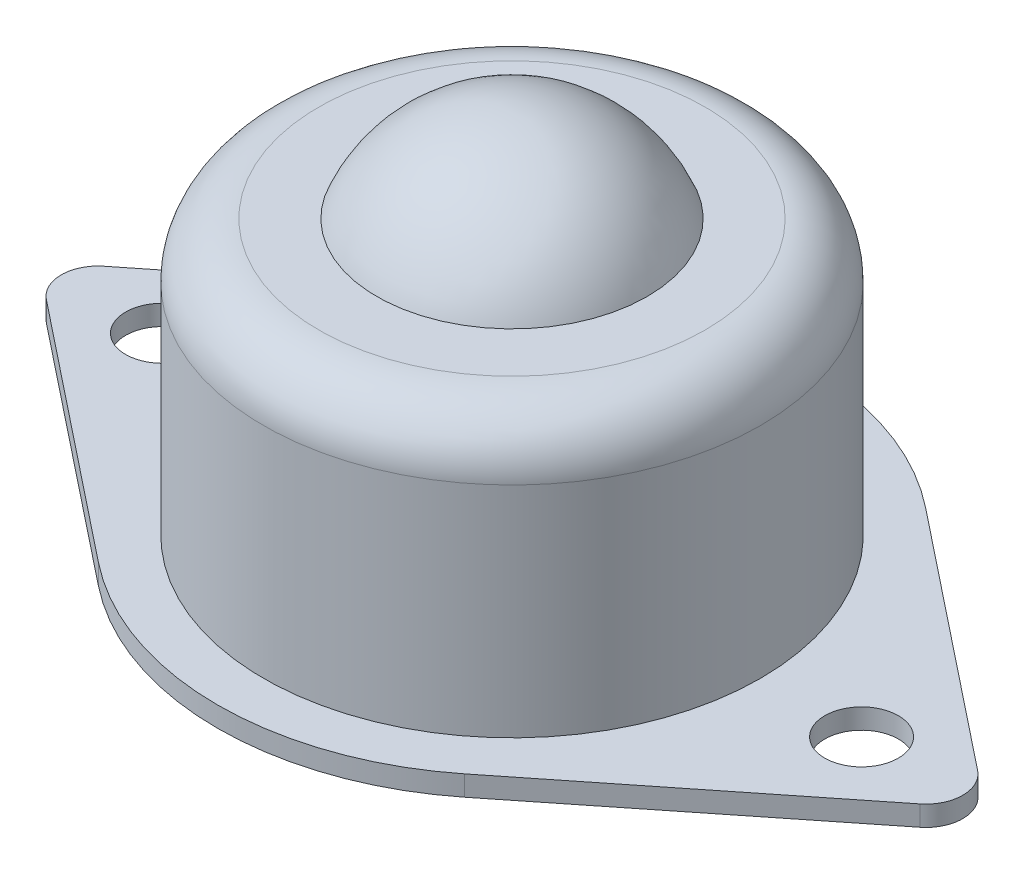
ISO-10303-21;
HEADER;
FILE_DESCRIPTION(('STEP AP214'),'2;1');
FILE_NAME('part.step','',(''),(''),'','','');
FILE_SCHEMA(('AUTOMOTIVE_DESIGN { 1 0 10303 214 1 1 1 1 }'));
ENDSEC;
DATA;
#1=APPLICATION_CONTEXT('core data for automotive mechanical design processes');
#2=APPLICATION_PROTOCOL_DEFINITION('international standard','automotive_design',2000,#1);
#3=PRODUCT_CONTEXT('',#1,'mechanical');
#4=PRODUCT('Part','Part','',(#3));
#5=PRODUCT_RELATED_PRODUCT_CATEGORY('part','',(#4));
#6=PRODUCT_DEFINITION_FORMATION('','',#4);
#7=PRODUCT_DEFINITION_CONTEXT('part definition',#1,'design');
#8=PRODUCT_DEFINITION('design','',#6,#7);
#9=PRODUCT_DEFINITION_SHAPE('','',#8);
#10=(LENGTH_UNIT() NAMED_UNIT(*) SI_UNIT(.MILLI.,.METRE.));
#11=(NAMED_UNIT(*) PLANE_ANGLE_UNIT() SI_UNIT($,.RADIAN.));
#12=(NAMED_UNIT(*) SI_UNIT($,.STERADIAN.) SOLID_ANGLE_UNIT());
#13=UNCERTAINTY_MEASURE_WITH_UNIT(LENGTH_MEASURE(1.E-05),#10,'distance_accuracy_value','');
#14=(GEOMETRIC_REPRESENTATION_CONTEXT(3) GLOBAL_UNCERTAINTY_ASSIGNED_CONTEXT((#13)) GLOBAL_UNIT_ASSIGNED_CONTEXT((#10,
#11,#12)) REPRESENTATION_CONTEXT('',''));
#15=CARTESIAN_POINT('',(0.,0.,0.));
#16=DIRECTION('',(0.,0.,1.));
#17=DIRECTION('',(1.,0.,0.));
#18=AXIS2_PLACEMENT_3D('',#15,#16,#17);
#19=CARTESIAN_POINT('',(0.,1.1,0.));
#20=DIRECTION('',(0.,1.,0.));
#21=DIRECTION('',(0.,0.,1.));
#22=AXIS2_PLACEMENT_3D('',#19,#20,#21);
#23=PLANE('',#22);
#24=CARTESIAN_POINT('',(19.,1.1,0.));
#25=DIRECTION('',(0.,1.,0.));
#26=DIRECTION('',(0.,0.,-1.));
#27=AXIS2_PLACEMENT_3D('',#24,#25,#26);
#28=CIRCLE('',#27,2.);
#29=CARTESIAN_POINT('',(19.,1.1,-2.00000000000001));
#30=VERTEX_POINT('',#29);
#31=EDGE_CURVE('E183',#30,#30,#28,.T.);
#32=ORIENTED_EDGE('',*,*,#31,.F.);
#33=EDGE_LOOP('',(#32));
#34=FACE_BOUND('',#33,.T.);
#35=CARTESIAN_POINT('',(0.,1.1,0.));
#36=DIRECTION('',(0.,1.,0.));
#37=DIRECTION('',(0.,0.,1.));
#38=AXIS2_PLACEMENT_3D('',#35,#36,#37);
#39=CIRCLE('',#38,16.);
#40=CARTESIAN_POINT('',(9.95555555555555,1.1,-12.5254506338194));
#41=VERTEX_POINT('',#40);
#42=CARTESIAN_POINT('',(-9.95555555555556,1.1,-12.5254506338194));
#43=VERTEX_POINT('',#42);
#44=EDGE_CURVE('E146',#41,#43,#39,.T.);
#45=ORIENTED_EDGE('',*,*,#44,.T.);
#46=DIRECTION('',(-0.782840664613713,0.,0.622222222222222));
#47=VECTOR('',#46,1.);
#48=CARTESIAN_POINT('',(-9.95555555555556,1.1,-12.5254506338194));
#49=LINE('',#48,#47);
#50=CARTESIAN_POINT('',(-23.7444444444444,1.1,-1.56568132922743));
#51=VERTEX_POINT('',#50);
#52=EDGE_CURVE('E94',#43,#51,#49,.T.);
#53=ORIENTED_EDGE('',*,*,#52,.T.);
#54=CARTESIAN_POINT('',(-22.5,1.1,0.));
#55=DIRECTION('',(0.,1.,0.));
#56=DIRECTION('',(0.,0.,1.));
#57=AXIS2_PLACEMENT_3D('',#54,#55,#56);
#58=CIRCLE('',#57,2.);
#59=CARTESIAN_POINT('',(-23.7444444444444,1.1,1.56568132922743));
#60=VERTEX_POINT('',#59);
#61=EDGE_CURVE('E161',#51,#60,#58,.T.);
#62=ORIENTED_EDGE('',*,*,#61,.T.);
#63=DIRECTION('',(0.782840664613713,0.,0.622222222222222));
#64=VECTOR('',#63,1.);
#65=CARTESIAN_POINT('',(-9.95555555555556,1.1,12.5254506338194));
#66=LINE('',#65,#64);
#67=CARTESIAN_POINT('',(-9.95555555555556,1.1,12.5254506338194));
#68=VERTEX_POINT('',#67);
#69=EDGE_CURVE('E174',#60,#68,#66,.T.);
#70=ORIENTED_EDGE('',*,*,#69,.T.);
#71=CARTESIAN_POINT('',(0.,1.1,0.));
#72=DIRECTION('',(0.,1.,0.));
#73=DIRECTION('',(0.,0.,1.));
#74=AXIS2_PLACEMENT_3D('',#71,#72,#73);
#75=CIRCLE('',#74,16.);
#76=CARTESIAN_POINT('',(9.95555555555555,1.1,12.5254506338194));
#77=VERTEX_POINT('',#76);
#78=EDGE_CURVE('E113',#68,#77,#75,.T.);
#79=ORIENTED_EDGE('',*,*,#78,.T.);
#80=DIRECTION('',(0.782840664613713,0.,-0.622222222222222));
#81=VECTOR('',#80,1.);
#82=CARTESIAN_POINT('',(9.95555555555556,1.1,12.5254506338194));
#83=LINE('',#82,#81);
#84=CARTESIAN_POINT('',(23.7444444444444,1.1,1.56568132922743));
#85=VERTEX_POINT('',#84);
#86=EDGE_CURVE('E107',#77,#85,#83,.T.);
#87=ORIENTED_EDGE('',*,*,#86,.T.);
#88=CARTESIAN_POINT('',(22.5,1.1,0.));
#89=DIRECTION('',(0.,1.,0.));
#90=DIRECTION('',(0.,0.,-1.));
#91=AXIS2_PLACEMENT_3D('',#88,#89,#90);
#92=CIRCLE('',#91,2.00000000000001);
#93=CARTESIAN_POINT('',(23.7444444444445,1.1,-1.56568132922744));
#94=VERTEX_POINT('',#93);
#95=EDGE_CURVE('E111',#85,#94,#92,.T.);
#96=ORIENTED_EDGE('',*,*,#95,.T.);
#97=DIRECTION('',(-0.782840664613713,0.,-0.622222222222222));
#98=VECTOR('',#97,1.);
#99=CARTESIAN_POINT('',(9.95555555555555,1.1,-12.5254506338194));
#100=LINE('',#99,#98);
#101=EDGE_CURVE('E51',#94,#41,#100,.T.);
#102=ORIENTED_EDGE('',*,*,#101,.T.);
#103=EDGE_LOOP('',(#45,#53,#62,#70,#79,#87,#96,#102));
#104=FACE_BOUND('',#103,.T.);
#105=CARTESIAN_POINT('',(-19.,1.1,0.));
#106=DIRECTION('',(0.,1.,0.));
#107=DIRECTION('',(0.,0.,1.));
#108=AXIS2_PLACEMENT_3D('',#105,#106,#107);
#109=CIRCLE('',#108,2.);
#110=CARTESIAN_POINT('',(-19.,1.1,2.));
#111=VERTEX_POINT('',#110);
#112=EDGE_CURVE('E135',#111,#111,#109,.T.);
#113=ORIENTED_EDGE('',*,*,#112,.F.);
#114=EDGE_LOOP('',(#113));
#115=FACE_BOUND('',#114,.T.);
#116=CARTESIAN_POINT('',(0.,1.1,0.));
#117=DIRECTION('',(0.,-1.,0.));
#118=DIRECTION('',(1.,0.,0.));
#119=AXIS2_PLACEMENT_3D('',#116,#117,#118);
#120=CIRCLE('',#119,13.5);
#121=CARTESIAN_POINT('',(13.5,1.1,0.));
#122=VERTEX_POINT('',#121);
#123=EDGE_CURVE('E200',#122,#122,#120,.T.);
#124=ORIENTED_EDGE('',*,*,#123,.T.);
#125=EDGE_LOOP('',(#124));
#126=FACE_BOUND('',#125,.T.);
#127=ADVANCED_FACE('F34',(#34,#104,#115,#126),#23,.T.);
#128=CARTESIAN_POINT('',(0.,0.,0.));
#129=DIRECTION('',(0.,1.,0.));
#130=DIRECTION('',(0.,0.,1.));
#131=AXIS2_PLACEMENT_3D('',#128,#129,#130);
#132=PLANE('',#131);
#133=CARTESIAN_POINT('',(-19.,0.,0.));
#134=DIRECTION('',(0.,1.,0.));
#135=DIRECTION('',(0.,0.,1.));
#136=AXIS2_PLACEMENT_3D('',#133,#134,#135);
#137=CIRCLE('',#136,2.);
#138=CARTESIAN_POINT('',(-19.,0.,2.));
#139=VERTEX_POINT('',#138);
#140=EDGE_CURVE('E180',#139,#139,#137,.T.);
#141=ORIENTED_EDGE('',*,*,#140,.T.);
#142=EDGE_LOOP('',(#141));
#143=FACE_BOUND('',#142,.T.);
#144=CARTESIAN_POINT('',(0.,0.,0.));
#145=DIRECTION('',(0.,1.,0.));
#146=DIRECTION('',(0.,0.,1.));
#147=AXIS2_PLACEMENT_3D('',#144,#145,#146);
#148=CIRCLE('',#147,16.);
#149=CARTESIAN_POINT('',(9.95555555555555,0.,-12.5254506338194));
#150=VERTEX_POINT('',#149);
#151=CARTESIAN_POINT('',(-9.95555555555556,0.,-12.5254506338194));
#152=VERTEX_POINT('',#151);
#153=EDGE_CURVE('E131',#150,#152,#148,.T.);
#154=ORIENTED_EDGE('',*,*,#153,.F.);
#155=DIRECTION('',(-0.782840664613713,0.,-0.622222222222222));
#156=VECTOR('',#155,1.);
#157=CARTESIAN_POINT('',(9.95555555555555,0.,-12.5254506338194));
#158=LINE('',#157,#156);
#159=CARTESIAN_POINT('',(23.7444444444445,0.,-1.56568132922744));
#160=VERTEX_POINT('',#159);
#161=EDGE_CURVE('E86',#160,#150,#158,.T.);
#162=ORIENTED_EDGE('',*,*,#161,.F.);
#163=CARTESIAN_POINT('',(22.5,0.,0.));
#164=DIRECTION('',(0.,1.,0.));
#165=DIRECTION('',(0.,0.,-1.));
#166=AXIS2_PLACEMENT_3D('',#163,#164,#165);
#167=CIRCLE('',#166,2.00000000000001);
#168=CARTESIAN_POINT('',(23.7444444444444,0.,1.56568132922743));
#169=VERTEX_POINT('',#168);
#170=EDGE_CURVE('E80',#169,#160,#167,.T.);
#171=ORIENTED_EDGE('',*,*,#170,.F.);
#172=DIRECTION('',(0.782840664613713,0.,-0.622222222222222));
#173=VECTOR('',#172,1.);
#174=CARTESIAN_POINT('',(9.95555555555556,0.,12.5254506338194));
#175=LINE('',#174,#173);
#176=CARTESIAN_POINT('',(9.95555555555555,0.,12.5254506338194));
#177=VERTEX_POINT('',#176);
#178=EDGE_CURVE('E121',#177,#169,#175,.T.);
#179=ORIENTED_EDGE('',*,*,#178,.F.);
#180=CARTESIAN_POINT('',(0.,0.,0.));
#181=DIRECTION('',(0.,1.,0.));
#182=DIRECTION('',(0.,0.,1.));
#183=AXIS2_PLACEMENT_3D('',#180,#181,#182);
#184=CIRCLE('',#183,16.);
#185=CARTESIAN_POINT('',(-9.95555555555556,0.,12.5254506338194));
#186=VERTEX_POINT('',#185);
#187=EDGE_CURVE('E141',#186,#177,#184,.T.);
#188=ORIENTED_EDGE('',*,*,#187,.F.);
#189=DIRECTION('',(0.782840664613713,0.,0.622222222222222));
#190=VECTOR('',#189,1.);
#191=CARTESIAN_POINT('',(-9.95555555555556,0.,12.5254506338194));
#192=LINE('',#191,#190);
#193=CARTESIAN_POINT('',(-23.7444444444444,0.,1.56568132922743));
#194=VERTEX_POINT('',#193);
#195=EDGE_CURVE('E139',#194,#186,#192,.T.);
#196=ORIENTED_EDGE('',*,*,#195,.F.);
#197=CARTESIAN_POINT('',(-22.5,0.,0.));
#198=DIRECTION('',(0.,1.,0.));
#199=DIRECTION('',(0.,0.,1.));
#200=AXIS2_PLACEMENT_3D('',#197,#198,#199);
#201=CIRCLE('',#200,2.);
#202=CARTESIAN_POINT('',(-23.7444444444444,0.,-1.56568132922743));
#203=VERTEX_POINT('',#202);
#204=EDGE_CURVE('E137',#203,#194,#201,.T.);
#205=ORIENTED_EDGE('',*,*,#204,.F.);
#206=DIRECTION('',(-0.782840664613713,0.,0.622222222222222));
#207=VECTOR('',#206,1.);
#208=CARTESIAN_POINT('',(-9.95555555555556,0.,-12.5254506338194));
#209=LINE('',#208,#207);
#210=EDGE_CURVE('E134',#152,#203,#209,.T.);
#211=ORIENTED_EDGE('',*,*,#210,.F.);
#212=EDGE_LOOP('',(#154,#162,#171,#179,#188,#196,#205,#211));
#213=FACE_BOUND('',#212,.T.);
#214=CARTESIAN_POINT('',(19.,0.,0.));
#215=DIRECTION('',(0.,1.,0.));
#216=DIRECTION('',(0.,0.,-1.));
#217=AXIS2_PLACEMENT_3D('',#214,#215,#216);
#218=CIRCLE('',#217,2.);
#219=CARTESIAN_POINT('',(19.,0.,-2.00000000000001));
#220=VERTEX_POINT('',#219);
#221=EDGE_CURVE('E186',#220,#220,#218,.T.);
#222=ORIENTED_EDGE('',*,*,#221,.T.);
#223=EDGE_LOOP('',(#222));
#224=FACE_BOUND('',#223,.T.);
#225=ADVANCED_FACE('F165',(#143,#213,#224),#132,.F.);
#226=CARTESIAN_POINT('',(0.,1.1,0.));
#227=DIRECTION('',(0.,-1.,0.));
#228=DIRECTION('',(0.,0.,-1.));
#229=AXIS2_PLACEMENT_3D('',#226,#227,#228);
#230=CYLINDRICAL_SURFACE('',#229,16.);
#231=ORIENTED_EDGE('',*,*,#153,.T.);
#232=DIRECTION('',(0.,-1.,0.));
#233=VECTOR('',#232,1.);
#234=CARTESIAN_POINT('',(-9.95555555555556,1.1,-12.5254506338194));
#235=LINE('',#234,#233);
#236=EDGE_CURVE('E11',#43,#152,#235,.T.);
#237=ORIENTED_EDGE('',*,*,#236,.F.);
#238=ORIENTED_EDGE('',*,*,#44,.F.);
#239=DIRECTION('',(0.,-1.,0.));
#240=VECTOR('',#239,1.);
#241=CARTESIAN_POINT('',(9.95555555555555,1.1,-12.5254506338194));
#242=LINE('',#241,#240);
#243=EDGE_CURVE('E127',#41,#150,#242,.T.);
#244=ORIENTED_EDGE('',*,*,#243,.T.);
#245=EDGE_LOOP('',(#231,#237,#238,#244));
#246=FACE_BOUND('',#245,.T.);
#247=ADVANCED_FACE('F36',(#246),#230,.T.);
#248=CARTESIAN_POINT('',(-9.95555555555556,1.1,-12.5254506338194));
#249=DIRECTION('',(0.622222222222222,0.,0.782840664613713));
#250=DIRECTION('',(0.782840664613713,0.,-0.622222222222222));
#251=AXIS2_PLACEMENT_3D('',#248,#249,#250);
#252=PLANE('',#251);
#253=ORIENTED_EDGE('',*,*,#210,.T.);
#254=DIRECTION('',(0.,-1.,0.));
#255=VECTOR('',#254,1.);
#256=CARTESIAN_POINT('',(-23.7444444444444,1.1,-1.56568132922743));
#257=LINE('',#256,#255);
#258=EDGE_CURVE('E43',#51,#203,#257,.T.);
#259=ORIENTED_EDGE('',*,*,#258,.F.);
#260=ORIENTED_EDGE('',*,*,#52,.F.);
#261=ORIENTED_EDGE('',*,*,#236,.T.);
#262=EDGE_LOOP('',(#253,#259,#260,#261));
#263=FACE_BOUND('',#262,.T.);
#264=ADVANCED_FACE('F256',(#263),#252,.F.);
#265=CARTESIAN_POINT('',(-22.5,1.1,0.));
#266=DIRECTION('',(0.,-1.,0.));
#267=DIRECTION('',(0.,0.,-1.));
#268=AXIS2_PLACEMENT_3D('',#265,#266,#267);
#269=CYLINDRICAL_SURFACE('',#268,2.);
#270=ORIENTED_EDGE('',*,*,#204,.T.);
#271=DIRECTION('',(0.,-1.,0.));
#272=VECTOR('',#271,1.);
#273=CARTESIAN_POINT('',(-23.7444444444444,1.1,1.56568132922743));
#274=LINE('',#273,#272);
#275=EDGE_CURVE('E153',#60,#194,#274,.T.);
#276=ORIENTED_EDGE('',*,*,#275,.F.);
#277=ORIENTED_EDGE('',*,*,#61,.F.);
#278=ORIENTED_EDGE('',*,*,#258,.T.);
#279=EDGE_LOOP('',(#270,#276,#277,#278));
#280=FACE_BOUND('',#279,.T.);
#281=ADVANCED_FACE('F159',(#280),#269,.T.);
#282=CARTESIAN_POINT('',(-9.95555555555556,1.1,12.5254506338194));
#283=DIRECTION('',(0.622222222222222,0.,-0.782840664613713));
#284=DIRECTION('',(-0.782840664613713,0.,-0.622222222222222));
#285=AXIS2_PLACEMENT_3D('',#282,#283,#284);
#286=PLANE('',#285);
#287=ORIENTED_EDGE('',*,*,#195,.T.);
#288=DIRECTION('',(0.,-1.,0.));
#289=VECTOR('',#288,1.);
#290=CARTESIAN_POINT('',(-9.95555555555556,1.1,12.5254506338194));
#291=LINE('',#290,#289);
#292=EDGE_CURVE('E150',#68,#186,#291,.T.);
#293=ORIENTED_EDGE('',*,*,#292,.F.);
#294=ORIENTED_EDGE('',*,*,#69,.F.);
#295=ORIENTED_EDGE('',*,*,#275,.T.);
#296=EDGE_LOOP('',(#287,#293,#294,#295));
#297=FACE_BOUND('',#296,.T.);
#298=ADVANCED_FACE('F170',(#297),#286,.F.);
#299=CARTESIAN_POINT('',(0.,1.1,0.));
#300=DIRECTION('',(0.,-1.,0.));
#301=DIRECTION('',(0.,0.,-1.));
#302=AXIS2_PLACEMENT_3D('',#299,#300,#301);
#303=CYLINDRICAL_SURFACE('',#302,16.);
#304=ORIENTED_EDGE('',*,*,#187,.T.);
#305=DIRECTION('',(0.,-1.,0.));
#306=VECTOR('',#305,1.);
#307=CARTESIAN_POINT('',(9.95555555555555,1.1,12.5254506338194));
#308=LINE('',#307,#306);
#309=EDGE_CURVE('E122',#77,#177,#308,.T.);
#310=ORIENTED_EDGE('',*,*,#309,.F.);
#311=ORIENTED_EDGE('',*,*,#78,.F.);
#312=ORIENTED_EDGE('',*,*,#292,.T.);
#313=EDGE_LOOP('',(#304,#310,#311,#312));
#314=FACE_BOUND('',#313,.T.);
#315=ADVANCED_FACE('F173',(#314),#303,.T.);
#316=CARTESIAN_POINT('',(9.95555555555556,1.1,12.5254506338194));
#317=DIRECTION('',(-0.622222222222222,0.,-0.782840664613713));
#318=DIRECTION('',(-0.782840664613713,0.,0.622222222222222));
#319=AXIS2_PLACEMENT_3D('',#316,#317,#318);
#320=PLANE('',#319);
#321=ORIENTED_EDGE('',*,*,#178,.T.);
#322=DIRECTION('',(0.,-1.,0.));
#323=VECTOR('',#322,1.);
#324=CARTESIAN_POINT('',(23.7444444444444,1.1,1.56568132922743));
#325=LINE('',#324,#323);
#326=EDGE_CURVE('E118',#85,#169,#325,.T.);
#327=ORIENTED_EDGE('',*,*,#326,.F.);
#328=ORIENTED_EDGE('',*,*,#86,.F.);
#329=ORIENTED_EDGE('',*,*,#309,.T.);
#330=EDGE_LOOP('',(#321,#327,#328,#329));
#331=FACE_BOUND('',#330,.T.);
#332=ADVANCED_FACE('F119',(#331),#320,.F.);
#333=CARTESIAN_POINT('',(22.5,1.1,0.));
#334=DIRECTION('',(0.,-1.,0.));
#335=DIRECTION('',(0.,0.,-1.));
#336=AXIS2_PLACEMENT_3D('',#333,#334,#335);
#337=CYLINDRICAL_SURFACE('',#336,2.00000000000001);
#338=ORIENTED_EDGE('',*,*,#170,.T.);
#339=DIRECTION('',(0.,-1.,0.));
#340=VECTOR('',#339,1.);
#341=CARTESIAN_POINT('',(23.7444444444445,1.1,-1.56568132922744));
#342=LINE('',#341,#340);
#343=EDGE_CURVE('E123',#94,#160,#342,.T.);
#344=ORIENTED_EDGE('',*,*,#343,.F.);
#345=ORIENTED_EDGE('',*,*,#95,.F.);
#346=ORIENTED_EDGE('',*,*,#326,.T.);
#347=EDGE_LOOP('',(#338,#344,#345,#346));
#348=FACE_BOUND('',#347,.T.);
#349=ADVANCED_FACE('F125',(#348),#337,.T.);
#350=CARTESIAN_POINT('',(9.95555555555555,1.1,-12.5254506338194));
#351=DIRECTION('',(-0.622222222222222,0.,0.782840664613713));
#352=DIRECTION('',(0.782840664613713,0.,0.622222222222222));
#353=AXIS2_PLACEMENT_3D('',#350,#351,#352);
#354=PLANE('',#353);
#355=ORIENTED_EDGE('',*,*,#161,.T.);
#356=ORIENTED_EDGE('',*,*,#243,.F.);
#357=ORIENTED_EDGE('',*,*,#101,.F.);
#358=ORIENTED_EDGE('',*,*,#343,.T.);
#359=EDGE_LOOP('',(#355,#356,#357,#358));
#360=FACE_BOUND('',#359,.T.);
#361=ADVANCED_FACE('F244',(#360),#354,.F.);
#362=CARTESIAN_POINT('',(-19.,1.1,0.));
#363=DIRECTION('',(0.,-1.,0.));
#364=DIRECTION('',(0.,0.,-1.));
#365=AXIS2_PLACEMENT_3D('',#362,#363,#364);
#366=CYLINDRICAL_SURFACE('',#365,2.);
#367=ORIENTED_EDGE('',*,*,#112,.T.);
#368=EDGE_LOOP('',(#367));
#369=FACE_BOUND('',#368,.T.);
#370=ORIENTED_EDGE('',*,*,#140,.F.);
#371=EDGE_LOOP('',(#370));
#372=FACE_BOUND('',#371,.T.);
#373=ADVANCED_FACE('F230',(#369,#372),#366,.F.);
#374=CARTESIAN_POINT('',(19.,1.1,0.));
#375=DIRECTION('',(0.,-1.,0.));
#376=DIRECTION('',(0.,0.,-1.));
#377=AXIS2_PLACEMENT_3D('',#374,#375,#376);
#378=CYLINDRICAL_SURFACE('',#377,2.);
#379=ORIENTED_EDGE('',*,*,#31,.T.);
#380=EDGE_LOOP('',(#379));
#381=FACE_BOUND('',#380,.T.);
#382=ORIENTED_EDGE('',*,*,#221,.F.);
#383=EDGE_LOOP('',(#382));
#384=FACE_BOUND('',#383,.T.);
#385=ADVANCED_FACE('F225',(#381,#384),#378,.F.);
#386=CARTESIAN_POINT('',(0.,13.1,0.));
#387=DIRECTION('',(0.,-1.,0.));
#388=DIRECTION('',(-1.,0.,0.));
#389=AXIS2_PLACEMENT_3D('',#386,#387,#388);
#390=SPHERICAL_SURFACE('',#389,7.9);
#391=CARTESIAN_POINT('',(0.,16.,0.));
#392=DIRECTION('',(0.,-1.,0.));
#393=DIRECTION('',(1.,0.,0.));
#394=AXIS2_PLACEMENT_3D('',#391,#392,#393);
#395=CIRCLE('',#394,7.34846922834953);
#396=CARTESIAN_POINT('',(7.34846922834953,16.,0.));
#397=VERTEX_POINT('',#396);
#398=EDGE_CURVE('E189',#397,#397,#395,.T.);
#399=ORIENTED_EDGE('',*,*,#398,.F.);
#400=EDGE_LOOP('',(#399));
#401=FACE_BOUND('',#400,.T.);
#402=ADVANCED_FACE('F220',(#401),#390,.T.);
#403=CARTESIAN_POINT('',(-10.5,16.,0.));
#404=DIRECTION('',(0.,-1.,0.));
#405=DIRECTION('',(1.,0.,0.));
#406=AXIS2_PLACEMENT_3D('',#403,#404,#405);
#407=PLANE('',#406);
#408=CARTESIAN_POINT('',(0.,16.,0.));
#409=DIRECTION('',(0.,-1.,0.));
#410=DIRECTION('',(1.,0.,0.));
#411=AXIS2_PLACEMENT_3D('',#408,#409,#410);
#412=CIRCLE('',#411,10.5);
#413=CARTESIAN_POINT('',(10.5,16.,0.));
#414=VERTEX_POINT('',#413);
#415=EDGE_CURVE('E194',#414,#414,#412,.T.);
#416=ORIENTED_EDGE('',*,*,#415,.F.);
#417=EDGE_LOOP('',(#416));
#418=FACE_BOUND('',#417,.T.);
#419=ORIENTED_EDGE('',*,*,#398,.T.);
#420=EDGE_LOOP('',(#419));
#421=FACE_BOUND('',#420,.T.);
#422=ADVANCED_FACE('F214',(#418,#421),#407,.F.);
#423=CARTESIAN_POINT('',(0.,13.,0.));
#424=DIRECTION('',(0.,-1.,0.));
#425=DIRECTION('',(1.,0.,0.));
#426=AXIS2_PLACEMENT_3D('',#423,#424,#425);
#427=TOROIDAL_SURFACE('',#426,10.5,3.);
#428=CARTESIAN_POINT('',(0.,13.,0.));
#429=DIRECTION('',(0.,-1.,0.));
#430=DIRECTION('',(1.,0.,0.));
#431=AXIS2_PLACEMENT_3D('',#428,#429,#430);
#432=CIRCLE('',#431,13.5);
#433=CARTESIAN_POINT('',(13.5,13.,0.));
#434=VERTEX_POINT('',#433);
#435=EDGE_CURVE('E197',#434,#434,#432,.T.);
#436=ORIENTED_EDGE('',*,*,#435,.F.);
#437=EDGE_LOOP('',(#436));
#438=FACE_BOUND('',#437,.T.);
#439=ORIENTED_EDGE('',*,*,#415,.T.);
#440=EDGE_LOOP('',(#439));
#441=FACE_BOUND('',#440,.T.);
#442=ADVANCED_FACE('F208',(#438,#441),#427,.T.);
#443=CARTESIAN_POINT('',(0.,1.1,0.));
#444=DIRECTION('',(0.,-1.,0.));
#445=DIRECTION('',(1.,0.,0.));
#446=AXIS2_PLACEMENT_3D('',#443,#444,#445);
#447=CYLINDRICAL_SURFACE('',#446,13.5);
#448=ORIENTED_EDGE('',*,*,#123,.F.);
#449=EDGE_LOOP('',(#448));
#450=FACE_BOUND('',#449,.T.);
#451=ORIENTED_EDGE('',*,*,#435,.T.);
#452=EDGE_LOOP('',(#451));
#453=FACE_BOUND('',#452,.T.);
#454=ADVANCED_FACE('F205',(#450,#453),#447,.T.);
#455=CLOSED_SHELL('',(#127,#225,#247,#264,#281,#298,#315,#332,#349,#361,#373,#385,#402,#422,
#442,#454));
#456=MANIFOLD_SOLID_BREP('B2',#455);
#457=ADVANCED_BREP_SHAPE_REPRESENTATION('',(#18,#456),#14);
#458=SHAPE_DEFINITION_REPRESENTATION(#9,#457);
ENDSEC;
END-ISO-10303-21;
